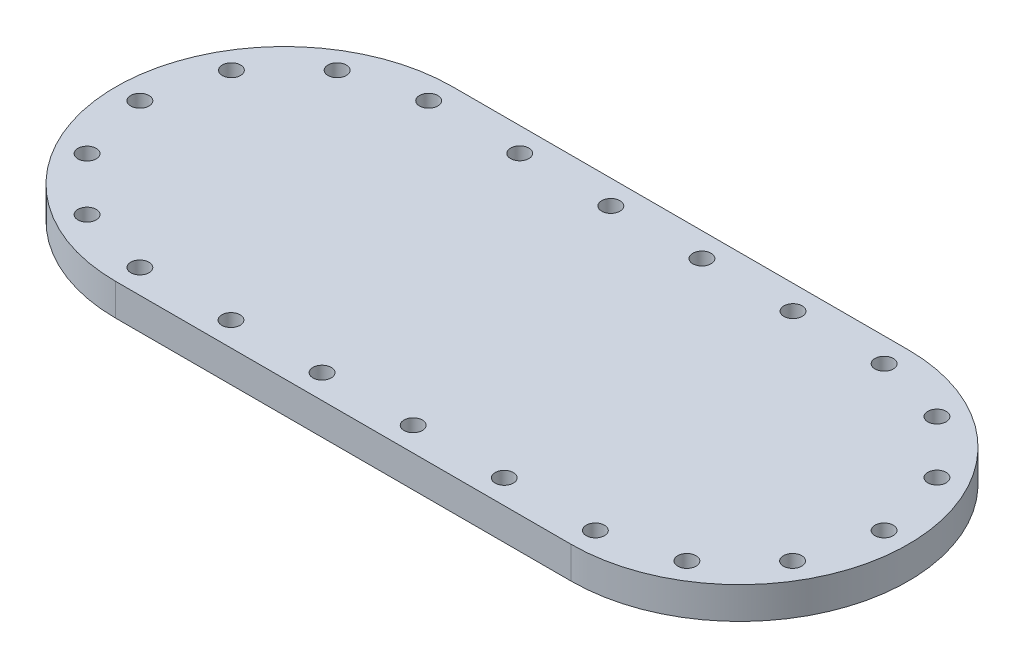
ISO-10303-21;
HEADER;
FILE_DESCRIPTION(('STEP AP214'),'2;1');
FILE_NAME('part.step','',(''),(''),'','','');
FILE_SCHEMA(('AUTOMOTIVE_DESIGN { 1 0 10303 214 1 1 1 1 }'));
ENDSEC;
DATA;
#1=APPLICATION_CONTEXT('core data for automotive mechanical design processes');
#2=APPLICATION_PROTOCOL_DEFINITION('international standard','automotive_design',2000,#1);
#3=PRODUCT_CONTEXT('',#1,'mechanical');
#4=PRODUCT('Part','Part','',(#3));
#5=PRODUCT_RELATED_PRODUCT_CATEGORY('part','',(#4));
#6=PRODUCT_DEFINITION_FORMATION('','',#4);
#7=PRODUCT_DEFINITION_CONTEXT('part definition',#1,'design');
#8=PRODUCT_DEFINITION('design','',#6,#7);
#9=PRODUCT_DEFINITION_SHAPE('','',#8);
#10=(LENGTH_UNIT() NAMED_UNIT(*) SI_UNIT(.MILLI.,.METRE.));
#11=(NAMED_UNIT(*) PLANE_ANGLE_UNIT() SI_UNIT($,.RADIAN.));
#12=(NAMED_UNIT(*) SI_UNIT($,.STERADIAN.) SOLID_ANGLE_UNIT());
#13=UNCERTAINTY_MEASURE_WITH_UNIT(LENGTH_MEASURE(1.E-05),#10,'distance_accuracy_value','');
#14=(GEOMETRIC_REPRESENTATION_CONTEXT(3) GLOBAL_UNCERTAINTY_ASSIGNED_CONTEXT((#13)) GLOBAL_UNIT_ASSIGNED_CONTEXT((#10,
#11,#12)) REPRESENTATION_CONTEXT('',''));
#15=CARTESIAN_POINT('',(0.,0.,0.));
#16=DIRECTION('',(0.,0.,1.));
#17=DIRECTION('',(1.,0.,0.));
#18=AXIS2_PLACEMENT_3D('',#15,#16,#17);
#19=CARTESIAN_POINT('',(0.,8.89,-46.99));
#20=DIRECTION('',(0.,0.,-1.));
#21=DIRECTION('',(-1.,0.,0.));
#22=AXIS2_PLACEMENT_3D('',#19,#20,#21);
#23=PLANE('',#22);
#24=DIRECTION('',(1.,0.,0.));
#25=VECTOR('',#24,1.);
#26=CARTESIAN_POINT('',(0.,0.,-46.99));
#27=LINE('',#26,#25);
#28=CARTESIAN_POINT('',(-63.5,0.,-46.99));
#29=VERTEX_POINT('',#28);
#30=CARTESIAN_POINT('',(63.5,0.,-46.99));
#31=VERTEX_POINT('',#30);
#32=EDGE_CURVE('E100',#29,#31,#27,.T.);
#33=ORIENTED_EDGE('',*,*,#32,.F.);
#34=DIRECTION('',(0.,-1.,0.));
#35=VECTOR('',#34,1.);
#36=CARTESIAN_POINT('',(-63.5,8.89,-46.99));
#37=LINE('',#36,#35);
#38=CARTESIAN_POINT('',(-63.5,8.89,-46.99));
#39=VERTEX_POINT('',#38);
#40=EDGE_CURVE('E11',#39,#29,#37,.T.);
#41=ORIENTED_EDGE('',*,*,#40,.F.);
#42=DIRECTION('',(1.,0.,0.));
#43=VECTOR('',#42,1.);
#44=CARTESIAN_POINT('',(0.,8.89,-46.99));
#45=LINE('',#44,#43);
#46=CARTESIAN_POINT('',(63.5,8.89,-46.99));
#47=VERTEX_POINT('',#46);
#48=EDGE_CURVE('E88',#39,#47,#45,.T.);
#49=ORIENTED_EDGE('',*,*,#48,.T.);
#50=DIRECTION('',(0.,-1.,0.));
#51=VECTOR('',#50,1.);
#52=CARTESIAN_POINT('',(63.5,8.89,-46.99));
#53=LINE('',#52,#51);
#54=EDGE_CURVE('E77',#47,#31,#53,.T.);
#55=ORIENTED_EDGE('',*,*,#54,.T.);
#56=EDGE_LOOP('',(#33,#41,#49,#55));
#57=FACE_BOUND('',#56,.T.);
#58=ADVANCED_FACE('F38',(#57),#23,.T.);
#59=CARTESIAN_POINT('',(-63.5,8.89,0.));
#60=DIRECTION('',(0.,-1.,0.));
#61=DIRECTION('',(0.,0.,-1.));
#62=AXIS2_PLACEMENT_3D('',#59,#60,#61);
#63=CYLINDRICAL_SURFACE('',#62,46.99);
#64=CARTESIAN_POINT('',(-63.5,0.,0.));
#65=DIRECTION('',(0.,1.,0.));
#66=DIRECTION('',(0.,0.,1.));
#67=AXIS2_PLACEMENT_3D('',#64,#65,#66);
#68=CIRCLE('',#67,46.99);
#69=CARTESIAN_POINT('',(-63.5,0.,46.99));
#70=VERTEX_POINT('',#69);
#71=EDGE_CURVE('E93',#29,#70,#68,.T.);
#72=ORIENTED_EDGE('',*,*,#71,.T.);
#73=DIRECTION('',(0.,-1.,0.));
#74=VECTOR('',#73,1.);
#75=CARTESIAN_POINT('',(-63.5,8.89,46.99));
#76=LINE('',#75,#74);
#77=CARTESIAN_POINT('',(-63.5,8.89,46.99));
#78=VERTEX_POINT('',#77);
#79=EDGE_CURVE('E46',#78,#70,#76,.T.);
#80=ORIENTED_EDGE('',*,*,#79,.F.);
#81=CARTESIAN_POINT('',(-63.5,8.89,0.));
#82=DIRECTION('',(0.,1.,0.));
#83=DIRECTION('',(0.,0.,1.));
#84=AXIS2_PLACEMENT_3D('',#81,#82,#83);
#85=CIRCLE('',#84,46.99);
#86=EDGE_CURVE('E83',#39,#78,#85,.T.);
#87=ORIENTED_EDGE('',*,*,#86,.F.);
#88=ORIENTED_EDGE('',*,*,#40,.T.);
#89=EDGE_LOOP('',(#72,#80,#87,#88));
#90=FACE_BOUND('',#89,.T.);
#91=ADVANCED_FACE('F91',(#90),#63,.T.);
#92=CARTESIAN_POINT('',(0.,8.89,46.99));
#93=DIRECTION('',(0.,0.,-1.));
#94=DIRECTION('',(-1.,0.,0.));
#95=AXIS2_PLACEMENT_3D('',#92,#93,#94);
#96=PLANE('',#95);
#97=DIRECTION('',(1.,0.,0.));
#98=VECTOR('',#97,1.);
#99=CARTESIAN_POINT('',(0.,0.,46.99));
#100=LINE('',#99,#98);
#101=CARTESIAN_POINT('',(63.5,0.,46.99));
#102=VERTEX_POINT('',#101);
#103=EDGE_CURVE('E70',#70,#102,#100,.T.);
#104=ORIENTED_EDGE('',*,*,#103,.T.);
#105=DIRECTION('',(0.,-1.,0.));
#106=VECTOR('',#105,1.);
#107=CARTESIAN_POINT('',(63.5,8.89,46.99));
#108=LINE('',#107,#106);
#109=CARTESIAN_POINT('',(63.5,8.89,46.99));
#110=VERTEX_POINT('',#109);
#111=EDGE_CURVE('E94',#110,#102,#108,.T.);
#112=ORIENTED_EDGE('',*,*,#111,.F.);
#113=DIRECTION('',(1.,0.,0.));
#114=VECTOR('',#113,1.);
#115=CARTESIAN_POINT('',(0.,8.89,46.99));
#116=LINE('',#115,#114);
#117=EDGE_CURVE('E87',#78,#110,#116,.T.);
#118=ORIENTED_EDGE('',*,*,#117,.F.);
#119=ORIENTED_EDGE('',*,*,#79,.T.);
#120=EDGE_LOOP('',(#104,#112,#118,#119));
#121=FACE_BOUND('',#120,.T.);
#122=ADVANCED_FACE('F95',(#121),#96,.F.);
#123=CARTESIAN_POINT('',(63.5,8.89,0.));
#124=DIRECTION('',(0.,-1.,0.));
#125=DIRECTION('',(0.,0.,-1.));
#126=AXIS2_PLACEMENT_3D('',#123,#124,#125);
#127=CYLINDRICAL_SURFACE('',#126,46.99);
#128=CARTESIAN_POINT('',(63.5,0.,0.));
#129=DIRECTION('',(0.,1.,0.));
#130=DIRECTION('',(0.,0.,1.));
#131=AXIS2_PLACEMENT_3D('',#128,#129,#130);
#132=CIRCLE('',#131,46.99);
#133=EDGE_CURVE('E106',#102,#31,#132,.T.);
#134=ORIENTED_EDGE('',*,*,#133,.T.);
#135=ORIENTED_EDGE('',*,*,#54,.F.);
#136=CARTESIAN_POINT('',(63.5,8.89,0.));
#137=DIRECTION('',(0.,1.,0.));
#138=DIRECTION('',(0.,0.,1.));
#139=AXIS2_PLACEMENT_3D('',#136,#137,#138);
#140=CIRCLE('',#139,46.99);
#141=EDGE_CURVE('E54',#110,#47,#140,.T.);
#142=ORIENTED_EDGE('',*,*,#141,.F.);
#143=ORIENTED_EDGE('',*,*,#111,.T.);
#144=EDGE_LOOP('',(#134,#135,#142,#143));
#145=FACE_BOUND('',#144,.T.);
#146=ADVANCED_FACE('F111',(#145),#127,.T.);
#147=CARTESIAN_POINT('',(0.,8.89,0.));
#148=DIRECTION('',(0.,1.,0.));
#149=DIRECTION('',(0.,0.,1.));
#150=AXIS2_PLACEMENT_3D('',#147,#148,#149);
#151=PLANE('',#150);
#152=CARTESIAN_POINT('',(63.5000000000001,8.89,-40.259));
#153=DIRECTION('',(0.,-1.,0.));
#154=DIRECTION('',(0.,0.,-1.));
#155=AXIS2_PLACEMENT_3D('',#152,#153,#154);
#156=CIRCLE('',#155,2.55270000000001);
#157=CARTESIAN_POINT('',(63.5000000000001,8.89,-42.8117));
#158=VERTEX_POINT('',#157);
#159=EDGE_CURVE('E256',#158,#158,#156,.T.);
#160=ORIENTED_EDGE('',*,*,#159,.T.);
#161=EDGE_LOOP('',(#160));
#162=FACE_BOUND('',#161,.T.);
#163=CARTESIAN_POINT('',(38.1000000000005,8.89,-40.2589999999993));
#164=DIRECTION('',(0.,-1.,0.));
#165=DIRECTION('',(0.,0.,-1.));
#166=AXIS2_PLACEMENT_3D('',#163,#164,#165);
#167=CIRCLE('',#166,2.55270000000005);
#168=CARTESIAN_POINT('',(38.1000000000005,8.89,-42.8116999999993));
#169=VERTEX_POINT('',#168);
#170=EDGE_CURVE('E263',#169,#169,#167,.T.);
#171=ORIENTED_EDGE('',*,*,#170,.T.);
#172=EDGE_LOOP('',(#171));
#173=FACE_BOUND('',#172,.T.);
#174=CARTESIAN_POINT('',(12.7000000000005,8.89,-40.2589999999995));
#175=DIRECTION('',(0.,-1.,0.));
#176=DIRECTION('',(0.,0.,-1.));
#177=AXIS2_PLACEMENT_3D('',#174,#175,#176);
#178=CIRCLE('',#177,2.5527);
#179=CARTESIAN_POINT('',(12.7000000000005,8.89,-42.8116999999995));
#180=VERTEX_POINT('',#179);
#181=EDGE_CURVE('E269',#180,#180,#178,.T.);
#182=ORIENTED_EDGE('',*,*,#181,.T.);
#183=EDGE_LOOP('',(#182));
#184=FACE_BOUND('',#183,.T.);
#185=CARTESIAN_POINT('',(-12.6999999999995,8.89,-40.2589999999996));
#186=DIRECTION('',(0.,-1.,0.));
#187=DIRECTION('',(0.,0.,-1.));
#188=AXIS2_PLACEMENT_3D('',#185,#186,#187);
#189=CIRCLE('',#188,2.5527);
#190=CARTESIAN_POINT('',(-12.6999999999995,8.89,-42.8116999999996));
#191=VERTEX_POINT('',#190);
#192=EDGE_CURVE('E275',#191,#191,#189,.T.);
#193=ORIENTED_EDGE('',*,*,#192,.T.);
#194=EDGE_LOOP('',(#193));
#195=FACE_BOUND('',#194,.T.);
#196=CARTESIAN_POINT('',(-38.0999999999995,8.89,-40.2589999999998));
#197=DIRECTION('',(0.,-1.,0.));
#198=DIRECTION('',(0.,0.,-1.));
#199=AXIS2_PLACEMENT_3D('',#196,#197,#198);
#200=CIRCLE('',#199,2.55270000000002);
#201=CARTESIAN_POINT('',(-38.0999999999995,8.89,-42.8116999999998));
#202=VERTEX_POINT('',#201);
#203=EDGE_CURVE('E281',#202,#202,#200,.T.);
#204=ORIENTED_EDGE('',*,*,#203,.T.);
#205=EDGE_LOOP('',(#204));
#206=FACE_BOUND('',#205,.T.);
#207=CARTESIAN_POINT('',(-63.4999999999999,8.89,-40.259));
#208=DIRECTION('',(0.,-1.,0.));
#209=DIRECTION('',(0.,0.,-1.));
#210=AXIS2_PLACEMENT_3D('',#207,#208,#209);
#211=CIRCLE('',#210,2.5527);
#212=CARTESIAN_POINT('',(-63.4999999999999,8.89,-42.8117));
#213=VERTEX_POINT('',#212);
#214=EDGE_CURVE('E287',#213,#213,#211,.T.);
#215=ORIENTED_EDGE('',*,*,#214,.T.);
#216=EDGE_LOOP('',(#215));
#217=FACE_BOUND('',#216,.T.);
#218=CARTESIAN_POINT('',(-83.6294999999993,8.89,-34.865316730959));
#219=DIRECTION('',(0.,-1.,0.));
#220=DIRECTION('',(0.,0.,-1.));
#221=AXIS2_PLACEMENT_3D('',#218,#219,#220);
#222=CIRCLE('',#221,2.55270000000001);
#223=CARTESIAN_POINT('',(-83.6294999999993,8.89,-37.418016730959));
#224=VERTEX_POINT('',#223);
#225=EDGE_CURVE('E293',#224,#224,#222,.T.);
#226=ORIENTED_EDGE('',*,*,#225,.T.);
#227=EDGE_LOOP('',(#226));
#228=FACE_BOUND('',#227,.T.);
#229=CARTESIAN_POINT('',(-98.3653167309572,8.89,-20.1295000000018));
#230=DIRECTION('',(0.,-1.,0.));
#231=DIRECTION('',(0.,0.,-1.));
#232=AXIS2_PLACEMENT_3D('',#229,#230,#231);
#233=CIRCLE('',#232,2.55270000000001);
#234=CARTESIAN_POINT('',(-98.3653167309572,8.89,-22.6822000000018));
#235=VERTEX_POINT('',#234);
#236=EDGE_CURVE('E299',#235,#235,#233,.T.);
#237=ORIENTED_EDGE('',*,*,#236,.T.);
#238=EDGE_LOOP('',(#237));
#239=FACE_BOUND('',#238,.T.);
#240=CARTESIAN_POINT('',(-103.759,8.89,7.24545224474049E-13));
#241=DIRECTION('',(0.,-1.,0.));
#242=DIRECTION('',(0.,0.,-1.));
#243=AXIS2_PLACEMENT_3D('',#240,#241,#242);
#244=CIRCLE('',#243,2.55270000000001);
#245=CARTESIAN_POINT('',(-103.759,8.89,-2.55269999999929));
#246=VERTEX_POINT('',#245);
#247=EDGE_CURVE('E305',#246,#246,#244,.T.);
#248=ORIENTED_EDGE('',*,*,#247,.T.);
#249=EDGE_LOOP('',(#248));
#250=FACE_BOUND('',#249,.T.);
#251=CARTESIAN_POINT('',(-98.3653167309575,8.89,20.1295000000004));
#252=DIRECTION('',(0.,-1.,0.));
#253=DIRECTION('',(0.,0.,-1.));
#254=AXIS2_PLACEMENT_3D('',#251,#252,#253);
#255=CIRCLE('',#254,2.55270000000001);
#256=CARTESIAN_POINT('',(-98.3653167309575,8.89,17.5768000000004));
#257=VERTEX_POINT('',#256);
#258=EDGE_CURVE('E311',#257,#257,#255,.T.);
#259=ORIENTED_EDGE('',*,*,#258,.T.);
#260=EDGE_LOOP('',(#259));
#261=FACE_BOUND('',#260,.T.);
#262=CARTESIAN_POINT('',(-83.6294999999998,8.89,34.8653167309579));
#263=DIRECTION('',(0.,-1.,0.));
#264=DIRECTION('',(0.,0.,-1.));
#265=AXIS2_PLACEMENT_3D('',#262,#263,#264);
#266=CIRCLE('',#265,2.55270000000003);
#267=CARTESIAN_POINT('',(-83.6294999999998,8.89,32.3126167309578));
#268=VERTEX_POINT('',#267);
#269=EDGE_CURVE('E317',#268,#268,#266,.T.);
#270=ORIENTED_EDGE('',*,*,#269,.T.);
#271=EDGE_LOOP('',(#270));
#272=FACE_BOUND('',#271,.T.);
#273=CARTESIAN_POINT('',(-63.5000000000005,8.89,40.2589999999991));
#274=DIRECTION('',(0.,-1.,0.));
#275=DIRECTION('',(0.,0.,-1.));
#276=AXIS2_PLACEMENT_3D('',#273,#274,#275);
#277=CIRCLE('',#276,2.55270000000001);
#278=CARTESIAN_POINT('',(-63.5000000000005,8.89,37.7062999999991));
#279=VERTEX_POINT('',#278);
#280=EDGE_CURVE('E323',#279,#279,#277,.T.);
#281=ORIENTED_EDGE('',*,*,#280,.T.);
#282=EDGE_LOOP('',(#281));
#283=FACE_BOUND('',#282,.T.);
#284=CARTESIAN_POINT('',(-38.1000000000001,8.89,40.2589999999993));
#285=DIRECTION('',(0.,-1.,0.));
#286=DIRECTION('',(0.,0.,-1.));
#287=AXIS2_PLACEMENT_3D('',#284,#285,#286);
#288=CIRCLE('',#287,2.55270000000001);
#289=CARTESIAN_POINT('',(-38.1000000000001,8.89,37.7062999999993));
#290=VERTEX_POINT('',#289);
#291=EDGE_CURVE('E329',#290,#290,#288,.T.);
#292=ORIENTED_EDGE('',*,*,#291,.T.);
#293=EDGE_LOOP('',(#292));
#294=FACE_BOUND('',#293,.T.);
#295=CARTESIAN_POINT('',(-12.7000000000001,8.89,40.2589999999995));
#296=DIRECTION('',(0.,-1.,0.));
#297=DIRECTION('',(0.,0.,-1.));
#298=AXIS2_PLACEMENT_3D('',#295,#296,#297);
#299=CIRCLE('',#298,2.55270000000001);
#300=CARTESIAN_POINT('',(-12.7000000000001,8.89,37.7062999999994));
#301=VERTEX_POINT('',#300);
#302=EDGE_CURVE('E335',#301,#301,#299,.T.);
#303=ORIENTED_EDGE('',*,*,#302,.T.);
#304=EDGE_LOOP('',(#303));
#305=FACE_BOUND('',#304,.T.);
#306=CARTESIAN_POINT('',(12.6999999999999,8.89,40.2589999999996));
#307=DIRECTION('',(0.,-1.,0.));
#308=DIRECTION('',(0.,0.,-1.));
#309=AXIS2_PLACEMENT_3D('',#306,#307,#308);
#310=CIRCLE('',#309,2.55270000000001);
#311=CARTESIAN_POINT('',(12.6999999999999,8.89,37.7062999999996));
#312=VERTEX_POINT('',#311);
#313=EDGE_CURVE('E341',#312,#312,#310,.T.);
#314=ORIENTED_EDGE('',*,*,#313,.T.);
#315=EDGE_LOOP('',(#314));
#316=FACE_BOUND('',#315,.T.);
#317=CARTESIAN_POINT('',(38.0999999999999,8.89,40.2589999999998));
#318=DIRECTION('',(0.,-1.,0.));
#319=DIRECTION('',(0.,0.,-1.));
#320=AXIS2_PLACEMENT_3D('',#317,#318,#319);
#321=CIRCLE('',#320,2.55270000000001);
#322=CARTESIAN_POINT('',(38.0999999999999,8.89,37.7062999999998));
#323=VERTEX_POINT('',#322);
#324=EDGE_CURVE('E347',#323,#323,#321,.T.);
#325=ORIENTED_EDGE('',*,*,#324,.T.);
#326=EDGE_LOOP('',(#325));
#327=FACE_BOUND('',#326,.T.);
#328=CARTESIAN_POINT('',(63.4999999999999,8.89,40.259));
#329=DIRECTION('',(0.,-1.,0.));
#330=DIRECTION('',(0.,0.,-1.));
#331=AXIS2_PLACEMENT_3D('',#328,#329,#330);
#332=CIRCLE('',#331,2.55270000000001);
#333=CARTESIAN_POINT('',(63.4999999999999,8.89,37.7063));
#334=VERTEX_POINT('',#333);
#335=EDGE_CURVE('E223',#334,#334,#332,.T.);
#336=ORIENTED_EDGE('',*,*,#335,.T.);
#337=EDGE_LOOP('',(#336));
#338=FACE_BOUND('',#337,.T.);
#339=CARTESIAN_POINT('',(83.6294999999998,8.89,34.8653167309579));
#340=DIRECTION('',(0.,-1.,0.));
#341=DIRECTION('',(0.,0.,-1.));
#342=AXIS2_PLACEMENT_3D('',#339,#340,#341);
#343=CIRCLE('',#342,2.55270000000003);
#344=CARTESIAN_POINT('',(83.6294999999998,8.89,32.3126167309578));
#345=VERTEX_POINT('',#344);
#346=EDGE_CURVE('E228',#345,#345,#343,.T.);
#347=ORIENTED_EDGE('',*,*,#346,.T.);
#348=EDGE_LOOP('',(#347));
#349=FACE_BOUND('',#348,.T.);
#350=CARTESIAN_POINT('',(98.3653167309575,8.89,20.1295000000004));
#351=DIRECTION('',(0.,-1.,0.));
#352=DIRECTION('',(0.,0.,-1.));
#353=AXIS2_PLACEMENT_3D('',#350,#351,#352);
#354=CIRCLE('',#353,2.55270000000001);
#355=CARTESIAN_POINT('',(98.3653167309575,8.89,17.5768000000004));
#356=VERTEX_POINT('',#355);
#357=EDGE_CURVE('E238',#356,#356,#354,.T.);
#358=ORIENTED_EDGE('',*,*,#357,.T.);
#359=EDGE_LOOP('',(#358));
#360=FACE_BOUND('',#359,.T.);
#361=CARTESIAN_POINT('',(103.759,8.89,7.24545224474049E-13));
#362=DIRECTION('',(0.,-1.,0.));
#363=DIRECTION('',(0.,0.,-1.));
#364=AXIS2_PLACEMENT_3D('',#361,#362,#363);
#365=CIRCLE('',#364,2.55270000000001);
#366=CARTESIAN_POINT('',(103.759,8.89,-2.55269999999929));
#367=VERTEX_POINT('',#366);
#368=EDGE_CURVE('E244',#367,#367,#365,.T.);
#369=ORIENTED_EDGE('',*,*,#368,.T.);
#370=EDGE_LOOP('',(#369));
#371=FACE_BOUND('',#370,.T.);
#372=CARTESIAN_POINT('',(98.3653167309578,8.89,-20.129499999999));
#373=DIRECTION('',(0.,-1.,0.));
#374=DIRECTION('',(0.,0.,-1.));
#375=AXIS2_PLACEMENT_3D('',#372,#373,#374);
#376=CIRCLE('',#375,2.55270000000001);
#377=CARTESIAN_POINT('',(98.3653167309578,8.89,-22.682199999999));
#378=VERTEX_POINT('',#377);
#379=EDGE_CURVE('E250',#378,#378,#376,.T.);
#380=ORIENTED_EDGE('',*,*,#379,.T.);
#381=EDGE_LOOP('',(#380));
#382=FACE_BOUND('',#381,.T.);
#383=CARTESIAN_POINT('',(83.6295000000002,8.89,-34.8653167309567));
#384=DIRECTION('',(0.,-1.,0.));
#385=DIRECTION('',(0.,0.,-1.));
#386=AXIS2_PLACEMENT_3D('',#383,#384,#385);
#387=CIRCLE('',#386,2.55270000000001);
#388=CARTESIAN_POINT('',(83.6295000000002,8.89,-37.4180167309567));
#389=VERTEX_POINT('',#388);
#390=EDGE_CURVE('E103',#389,#389,#387,.T.);
#391=ORIENTED_EDGE('',*,*,#390,.T.);
#392=EDGE_LOOP('',(#391));
#393=FACE_BOUND('',#392,.T.);
#394=ORIENTED_EDGE('',*,*,#48,.F.);
#395=ORIENTED_EDGE('',*,*,#86,.T.);
#396=ORIENTED_EDGE('',*,*,#117,.T.);
#397=ORIENTED_EDGE('',*,*,#141,.T.);
#398=EDGE_LOOP('',(#394,#395,#396,#397));
#399=FACE_BOUND('',#398,.T.);
#400=ADVANCED_FACE('F85',(#162,#173,#184,#195,#206,#217,#228,#239,#250,#261,#272,#283,#294,#305,
#316,#327,#338,#349,#360,#371,#382,#393,#399),#151,.T.);
#401=CARTESIAN_POINT('',(0.,0.,0.));
#402=DIRECTION('',(0.,1.,0.));
#403=DIRECTION('',(0.,0.,1.));
#404=AXIS2_PLACEMENT_3D('',#401,#402,#403);
#405=PLANE('',#404);
#406=CARTESIAN_POINT('',(63.5000000000001,0.,-40.259));
#407=DIRECTION('',(0.,-1.,0.));
#408=DIRECTION('',(0.,0.,-1.));
#409=AXIS2_PLACEMENT_3D('',#406,#407,#408);
#410=CIRCLE('',#409,2.55270000000001);
#411=CARTESIAN_POINT('',(63.5000000000001,0.,-42.8117));
#412=VERTEX_POINT('',#411);
#413=EDGE_CURVE('E260',#412,#412,#410,.T.);
#414=ORIENTED_EDGE('',*,*,#413,.F.);
#415=EDGE_LOOP('',(#414));
#416=FACE_BOUND('',#415,.T.);
#417=CARTESIAN_POINT('',(38.1000000000005,0.,-40.2589999999993));
#418=DIRECTION('',(0.,-1.,0.));
#419=DIRECTION('',(0.,0.,-1.));
#420=AXIS2_PLACEMENT_3D('',#417,#418,#419);
#421=CIRCLE('',#420,2.55270000000005);
#422=CARTESIAN_POINT('',(38.1000000000005,0.,-42.8116999999993));
#423=VERTEX_POINT('',#422);
#424=EDGE_CURVE('E266',#423,#423,#421,.T.);
#425=ORIENTED_EDGE('',*,*,#424,.F.);
#426=EDGE_LOOP('',(#425));
#427=FACE_BOUND('',#426,.T.);
#428=CARTESIAN_POINT('',(12.7000000000005,0.,-40.2589999999995));
#429=DIRECTION('',(0.,-1.,0.));
#430=DIRECTION('',(0.,0.,-1.));
#431=AXIS2_PLACEMENT_3D('',#428,#429,#430);
#432=CIRCLE('',#431,2.5527);
#433=CARTESIAN_POINT('',(12.7000000000005,0.,-42.8116999999995));
#434=VERTEX_POINT('',#433);
#435=EDGE_CURVE('E272',#434,#434,#432,.T.);
#436=ORIENTED_EDGE('',*,*,#435,.F.);
#437=EDGE_LOOP('',(#436));
#438=FACE_BOUND('',#437,.T.);
#439=CARTESIAN_POINT('',(-12.6999999999995,0.,-40.2589999999996));
#440=DIRECTION('',(0.,-1.,0.));
#441=DIRECTION('',(0.,0.,-1.));
#442=AXIS2_PLACEMENT_3D('',#439,#440,#441);
#443=CIRCLE('',#442,2.5527);
#444=CARTESIAN_POINT('',(-12.6999999999995,0.,-42.8116999999996));
#445=VERTEX_POINT('',#444);
#446=EDGE_CURVE('E278',#445,#445,#443,.T.);
#447=ORIENTED_EDGE('',*,*,#446,.F.);
#448=EDGE_LOOP('',(#447));
#449=FACE_BOUND('',#448,.T.);
#450=CARTESIAN_POINT('',(-38.0999999999995,0.,-40.2589999999998));
#451=DIRECTION('',(0.,-1.,0.));
#452=DIRECTION('',(0.,0.,-1.));
#453=AXIS2_PLACEMENT_3D('',#450,#451,#452);
#454=CIRCLE('',#453,2.55270000000002);
#455=CARTESIAN_POINT('',(-38.0999999999995,0.,-42.8116999999998));
#456=VERTEX_POINT('',#455);
#457=EDGE_CURVE('E284',#456,#456,#454,.T.);
#458=ORIENTED_EDGE('',*,*,#457,.F.);
#459=EDGE_LOOP('',(#458));
#460=FACE_BOUND('',#459,.T.);
#461=CARTESIAN_POINT('',(-63.4999999999999,0.,-40.259));
#462=DIRECTION('',(0.,-1.,0.));
#463=DIRECTION('',(0.,0.,-1.));
#464=AXIS2_PLACEMENT_3D('',#461,#462,#463);
#465=CIRCLE('',#464,2.5527);
#466=CARTESIAN_POINT('',(-63.4999999999999,0.,-42.8117));
#467=VERTEX_POINT('',#466);
#468=EDGE_CURVE('E290',#467,#467,#465,.T.);
#469=ORIENTED_EDGE('',*,*,#468,.F.);
#470=EDGE_LOOP('',(#469));
#471=FACE_BOUND('',#470,.T.);
#472=CARTESIAN_POINT('',(-83.6294999999993,0.,-34.865316730959));
#473=DIRECTION('',(0.,-1.,0.));
#474=DIRECTION('',(0.,0.,-1.));
#475=AXIS2_PLACEMENT_3D('',#472,#473,#474);
#476=CIRCLE('',#475,2.55270000000001);
#477=CARTESIAN_POINT('',(-83.6294999999993,0.,-37.418016730959));
#478=VERTEX_POINT('',#477);
#479=EDGE_CURVE('E296',#478,#478,#476,.T.);
#480=ORIENTED_EDGE('',*,*,#479,.F.);
#481=EDGE_LOOP('',(#480));
#482=FACE_BOUND('',#481,.T.);
#483=CARTESIAN_POINT('',(-98.3653167309572,0.,-20.1295000000018));
#484=DIRECTION('',(0.,-1.,0.));
#485=DIRECTION('',(0.,0.,-1.));
#486=AXIS2_PLACEMENT_3D('',#483,#484,#485);
#487=CIRCLE('',#486,2.55270000000001);
#488=CARTESIAN_POINT('',(-98.3653167309572,0.,-22.6822000000018));
#489=VERTEX_POINT('',#488);
#490=EDGE_CURVE('E302',#489,#489,#487,.T.);
#491=ORIENTED_EDGE('',*,*,#490,.F.);
#492=EDGE_LOOP('',(#491));
#493=FACE_BOUND('',#492,.T.);
#494=CARTESIAN_POINT('',(-103.759,0.,7.24545224474049E-13));
#495=DIRECTION('',(0.,-1.,0.));
#496=DIRECTION('',(0.,0.,-1.));
#497=AXIS2_PLACEMENT_3D('',#494,#495,#496);
#498=CIRCLE('',#497,2.55270000000001);
#499=CARTESIAN_POINT('',(-103.759,0.,-2.55269999999929));
#500=VERTEX_POINT('',#499);
#501=EDGE_CURVE('E308',#500,#500,#498,.T.);
#502=ORIENTED_EDGE('',*,*,#501,.F.);
#503=EDGE_LOOP('',(#502));
#504=FACE_BOUND('',#503,.T.);
#505=CARTESIAN_POINT('',(-98.3653167309575,0.,20.1295000000004));
#506=DIRECTION('',(0.,-1.,0.));
#507=DIRECTION('',(0.,0.,-1.));
#508=AXIS2_PLACEMENT_3D('',#505,#506,#507);
#509=CIRCLE('',#508,2.55270000000001);
#510=CARTESIAN_POINT('',(-98.3653167309575,0.,17.5768000000004));
#511=VERTEX_POINT('',#510);
#512=EDGE_CURVE('E314',#511,#511,#509,.T.);
#513=ORIENTED_EDGE('',*,*,#512,.F.);
#514=EDGE_LOOP('',(#513));
#515=FACE_BOUND('',#514,.T.);
#516=CARTESIAN_POINT('',(-83.6294999999998,0.,34.8653167309579));
#517=DIRECTION('',(0.,-1.,0.));
#518=DIRECTION('',(0.,0.,-1.));
#519=AXIS2_PLACEMENT_3D('',#516,#517,#518);
#520=CIRCLE('',#519,2.55270000000003);
#521=CARTESIAN_POINT('',(-83.6294999999998,0.,32.3126167309578));
#522=VERTEX_POINT('',#521);
#523=EDGE_CURVE('E320',#522,#522,#520,.T.);
#524=ORIENTED_EDGE('',*,*,#523,.F.);
#525=EDGE_LOOP('',(#524));
#526=FACE_BOUND('',#525,.T.);
#527=CARTESIAN_POINT('',(-63.5000000000005,0.,40.2589999999991));
#528=DIRECTION('',(0.,-1.,0.));
#529=DIRECTION('',(0.,0.,-1.));
#530=AXIS2_PLACEMENT_3D('',#527,#528,#529);
#531=CIRCLE('',#530,2.55270000000001);
#532=CARTESIAN_POINT('',(-63.5000000000005,0.,37.7062999999991));
#533=VERTEX_POINT('',#532);
#534=EDGE_CURVE('E326',#533,#533,#531,.T.);
#535=ORIENTED_EDGE('',*,*,#534,.F.);
#536=EDGE_LOOP('',(#535));
#537=FACE_BOUND('',#536,.T.);
#538=CARTESIAN_POINT('',(-38.1000000000001,0.,40.2589999999993));
#539=DIRECTION('',(0.,-1.,0.));
#540=DIRECTION('',(0.,0.,-1.));
#541=AXIS2_PLACEMENT_3D('',#538,#539,#540);
#542=CIRCLE('',#541,2.55270000000001);
#543=CARTESIAN_POINT('',(-38.1000000000001,0.,37.7062999999993));
#544=VERTEX_POINT('',#543);
#545=EDGE_CURVE('E332',#544,#544,#542,.T.);
#546=ORIENTED_EDGE('',*,*,#545,.F.);
#547=EDGE_LOOP('',(#546));
#548=FACE_BOUND('',#547,.T.);
#549=CARTESIAN_POINT('',(-12.7000000000001,0.,40.2589999999995));
#550=DIRECTION('',(0.,-1.,0.));
#551=DIRECTION('',(0.,0.,-1.));
#552=AXIS2_PLACEMENT_3D('',#549,#550,#551);
#553=CIRCLE('',#552,2.55270000000001);
#554=CARTESIAN_POINT('',(-12.7000000000001,0.,37.7062999999994));
#555=VERTEX_POINT('',#554);
#556=EDGE_CURVE('E338',#555,#555,#553,.T.);
#557=ORIENTED_EDGE('',*,*,#556,.F.);
#558=EDGE_LOOP('',(#557));
#559=FACE_BOUND('',#558,.T.);
#560=CARTESIAN_POINT('',(12.6999999999999,0.,40.2589999999996));
#561=DIRECTION('',(0.,-1.,0.));
#562=DIRECTION('',(0.,0.,-1.));
#563=AXIS2_PLACEMENT_3D('',#560,#561,#562);
#564=CIRCLE('',#563,2.55270000000001);
#565=CARTESIAN_POINT('',(12.6999999999999,0.,37.7062999999996));
#566=VERTEX_POINT('',#565);
#567=EDGE_CURVE('E344',#566,#566,#564,.T.);
#568=ORIENTED_EDGE('',*,*,#567,.F.);
#569=EDGE_LOOP('',(#568));
#570=FACE_BOUND('',#569,.T.);
#571=CARTESIAN_POINT('',(38.0999999999999,0.,40.2589999999998));
#572=DIRECTION('',(0.,-1.,0.));
#573=DIRECTION('',(0.,0.,-1.));
#574=AXIS2_PLACEMENT_3D('',#571,#572,#573);
#575=CIRCLE('',#574,2.55270000000001);
#576=CARTESIAN_POINT('',(38.0999999999999,0.,37.7062999999998));
#577=VERTEX_POINT('',#576);
#578=EDGE_CURVE('E230',#577,#577,#575,.T.);
#579=ORIENTED_EDGE('',*,*,#578,.F.);
#580=EDGE_LOOP('',(#579));
#581=FACE_BOUND('',#580,.T.);
#582=CARTESIAN_POINT('',(63.4999999999999,0.,40.259));
#583=DIRECTION('',(0.,-1.,0.));
#584=DIRECTION('',(0.,0.,-1.));
#585=AXIS2_PLACEMENT_3D('',#582,#583,#584);
#586=CIRCLE('',#585,2.55270000000001);
#587=CARTESIAN_POINT('',(63.4999999999999,0.,37.7063));
#588=VERTEX_POINT('',#587);
#589=EDGE_CURVE('E226',#588,#588,#586,.T.);
#590=ORIENTED_EDGE('',*,*,#589,.F.);
#591=EDGE_LOOP('',(#590));
#592=FACE_BOUND('',#591,.T.);
#593=CARTESIAN_POINT('',(83.6294999999998,0.,34.8653167309579));
#594=DIRECTION('',(0.,-1.,0.));
#595=DIRECTION('',(0.,0.,-1.));
#596=AXIS2_PLACEMENT_3D('',#593,#594,#595);
#597=CIRCLE('',#596,2.55270000000003);
#598=CARTESIAN_POINT('',(83.6294999999998,0.,32.3126167309578));
#599=VERTEX_POINT('',#598);
#600=EDGE_CURVE('E233',#599,#599,#597,.T.);
#601=ORIENTED_EDGE('',*,*,#600,.F.);
#602=EDGE_LOOP('',(#601));
#603=FACE_BOUND('',#602,.T.);
#604=CARTESIAN_POINT('',(98.3653167309575,0.,20.1295000000004));
#605=DIRECTION('',(0.,-1.,0.));
#606=DIRECTION('',(0.,0.,-1.));
#607=AXIS2_PLACEMENT_3D('',#604,#605,#606);
#608=CIRCLE('',#607,2.55270000000001);
#609=CARTESIAN_POINT('',(98.3653167309575,0.,17.5768000000004));
#610=VERTEX_POINT('',#609);
#611=EDGE_CURVE('E241',#610,#610,#608,.T.);
#612=ORIENTED_EDGE('',*,*,#611,.F.);
#613=EDGE_LOOP('',(#612));
#614=FACE_BOUND('',#613,.T.);
#615=CARTESIAN_POINT('',(103.759,0.,7.24545224474049E-13));
#616=DIRECTION('',(0.,-1.,0.));
#617=DIRECTION('',(0.,0.,-1.));
#618=AXIS2_PLACEMENT_3D('',#615,#616,#617);
#619=CIRCLE('',#618,2.55270000000001);
#620=CARTESIAN_POINT('',(103.759,0.,-2.55269999999929));
#621=VERTEX_POINT('',#620);
#622=EDGE_CURVE('E247',#621,#621,#619,.T.);
#623=ORIENTED_EDGE('',*,*,#622,.F.);
#624=EDGE_LOOP('',(#623));
#625=FACE_BOUND('',#624,.T.);
#626=CARTESIAN_POINT('',(98.3653167309578,0.,-20.129499999999));
#627=DIRECTION('',(0.,-1.,0.));
#628=DIRECTION('',(0.,0.,-1.));
#629=AXIS2_PLACEMENT_3D('',#626,#627,#628);
#630=CIRCLE('',#629,2.55270000000001);
#631=CARTESIAN_POINT('',(98.3653167309578,0.,-22.682199999999));
#632=VERTEX_POINT('',#631);
#633=EDGE_CURVE('E253',#632,#632,#630,.T.);
#634=ORIENTED_EDGE('',*,*,#633,.F.);
#635=EDGE_LOOP('',(#634));
#636=FACE_BOUND('',#635,.T.);
#637=CARTESIAN_POINT('',(83.6295000000002,0.,-34.8653167309567));
#638=DIRECTION('',(0.,-1.,0.));
#639=DIRECTION('',(0.,0.,-1.));
#640=AXIS2_PLACEMENT_3D('',#637,#638,#639);
#641=CIRCLE('',#640,2.55270000000001);
#642=CARTESIAN_POINT('',(83.6295000000002,0.,-37.4180167309567));
#643=VERTEX_POINT('',#642);
#644=EDGE_CURVE('E259',#643,#643,#641,.T.);
#645=ORIENTED_EDGE('',*,*,#644,.F.);
#646=EDGE_LOOP('',(#645));
#647=FACE_BOUND('',#646,.T.);
#648=ORIENTED_EDGE('',*,*,#32,.T.);
#649=ORIENTED_EDGE('',*,*,#133,.F.);
#650=ORIENTED_EDGE('',*,*,#103,.F.);
#651=ORIENTED_EDGE('',*,*,#71,.F.);
#652=EDGE_LOOP('',(#648,#649,#650,#651));
#653=FACE_BOUND('',#652,.T.);
#654=ADVANCED_FACE('F113',(#416,#427,#438,#449,#460,#471,#482,#493,#504,#515,#526,#537,#548,
#559,#570,#581,#592,#603,#614,#625,#636,#647,#653),#405,.F.);
#655=CARTESIAN_POINT('',(83.6295000000002,8.89,-34.8653167309567));
#656=DIRECTION('',(0.,-1.,0.));
#657=DIRECTION('',(0.,0.,-1.));
#658=AXIS2_PLACEMENT_3D('',#655,#656,#657);
#659=CYLINDRICAL_SURFACE('',#658,2.55270000000001);
#660=ORIENTED_EDGE('',*,*,#390,.F.);
#661=EDGE_LOOP('',(#660));
#662=FACE_BOUND('',#661,.T.);
#663=ORIENTED_EDGE('',*,*,#644,.T.);
#664=EDGE_LOOP('',(#663));
#665=FACE_BOUND('',#664,.T.);
#666=ADVANCED_FACE('F127',(#662,#665),#659,.F.);
#667=CARTESIAN_POINT('',(98.3653167309578,8.89,-20.129499999999));
#668=DIRECTION('',(0.,-1.,0.));
#669=DIRECTION('',(0.,0.,-1.));
#670=AXIS2_PLACEMENT_3D('',#667,#668,#669);
#671=CYLINDRICAL_SURFACE('',#670,2.55270000000001);
#672=ORIENTED_EDGE('',*,*,#379,.F.);
#673=EDGE_LOOP('',(#672));
#674=FACE_BOUND('',#673,.T.);
#675=ORIENTED_EDGE('',*,*,#633,.T.);
#676=EDGE_LOOP('',(#675));
#677=FACE_BOUND('',#676,.T.);
#678=ADVANCED_FACE('F134',(#674,#677),#671,.F.);
#679=CARTESIAN_POINT('',(103.759,8.89,7.24545224474049E-13));
#680=DIRECTION('',(0.,-1.,0.));
#681=DIRECTION('',(0.,0.,-1.));
#682=AXIS2_PLACEMENT_3D('',#679,#680,#681);
#683=CYLINDRICAL_SURFACE('',#682,2.55270000000001);
#684=ORIENTED_EDGE('',*,*,#368,.F.);
#685=EDGE_LOOP('',(#684));
#686=FACE_BOUND('',#685,.T.);
#687=ORIENTED_EDGE('',*,*,#622,.T.);
#688=EDGE_LOOP('',(#687));
#689=FACE_BOUND('',#688,.T.);
#690=ADVANCED_FACE('F203',(#686,#689),#683,.F.);
#691=CARTESIAN_POINT('',(98.3653167309575,8.89,20.1295000000004));
#692=DIRECTION('',(0.,-1.,0.));
#693=DIRECTION('',(0.,0.,-1.));
#694=AXIS2_PLACEMENT_3D('',#691,#692,#693);
#695=CYLINDRICAL_SURFACE('',#694,2.55270000000001);
#696=ORIENTED_EDGE('',*,*,#357,.F.);
#697=EDGE_LOOP('',(#696));
#698=FACE_BOUND('',#697,.T.);
#699=ORIENTED_EDGE('',*,*,#611,.T.);
#700=EDGE_LOOP('',(#699));
#701=FACE_BOUND('',#700,.T.);
#702=ADVANCED_FACE('F207',(#698,#701),#695,.F.);
#703=CARTESIAN_POINT('',(83.6294999999998,8.89,34.8653167309579));
#704=DIRECTION('',(0.,-1.,0.));
#705=DIRECTION('',(0.,0.,-1.));
#706=AXIS2_PLACEMENT_3D('',#703,#704,#705);
#707=CYLINDRICAL_SURFACE('',#706,2.55270000000003);
#708=ORIENTED_EDGE('',*,*,#346,.F.);
#709=EDGE_LOOP('',(#708));
#710=FACE_BOUND('',#709,.T.);
#711=ORIENTED_EDGE('',*,*,#600,.T.);
#712=EDGE_LOOP('',(#711));
#713=FACE_BOUND('',#712,.T.);
#714=ADVANCED_FACE('F211',(#710,#713),#707,.F.);
#715=CARTESIAN_POINT('',(63.4999999999999,8.89,40.259));
#716=DIRECTION('',(0.,-1.,0.));
#717=DIRECTION('',(0.,0.,-1.));
#718=AXIS2_PLACEMENT_3D('',#715,#716,#717);
#719=CYLINDRICAL_SURFACE('',#718,2.55270000000001);
#720=ORIENTED_EDGE('',*,*,#335,.F.);
#721=EDGE_LOOP('',(#720));
#722=FACE_BOUND('',#721,.T.);
#723=ORIENTED_EDGE('',*,*,#589,.T.);
#724=EDGE_LOOP('',(#723));
#725=FACE_BOUND('',#724,.T.);
#726=ADVANCED_FACE('F140',(#722,#725),#719,.F.);
#727=CARTESIAN_POINT('',(38.0999999999999,8.89,40.2589999999998));
#728=DIRECTION('',(0.,-1.,0.));
#729=DIRECTION('',(0.,0.,-1.));
#730=AXIS2_PLACEMENT_3D('',#727,#728,#729);
#731=CYLINDRICAL_SURFACE('',#730,2.55270000000001);
#732=ORIENTED_EDGE('',*,*,#324,.F.);
#733=EDGE_LOOP('',(#732));
#734=FACE_BOUND('',#733,.T.);
#735=ORIENTED_EDGE('',*,*,#578,.T.);
#736=EDGE_LOOP('',(#735));
#737=FACE_BOUND('',#736,.T.);
#738=ADVANCED_FACE('F136',(#734,#737),#731,.F.);
#739=CARTESIAN_POINT('',(12.6999999999999,8.89,40.2589999999996));
#740=DIRECTION('',(0.,-1.,0.));
#741=DIRECTION('',(0.,0.,-1.));
#742=AXIS2_PLACEMENT_3D('',#739,#740,#741);
#743=CYLINDRICAL_SURFACE('',#742,2.55270000000001);
#744=ORIENTED_EDGE('',*,*,#313,.F.);
#745=EDGE_LOOP('',(#744));
#746=FACE_BOUND('',#745,.T.);
#747=ORIENTED_EDGE('',*,*,#567,.T.);
#748=EDGE_LOOP('',(#747));
#749=FACE_BOUND('',#748,.T.);
#750=ADVANCED_FACE('F139',(#746,#749),#743,.F.);
#751=CARTESIAN_POINT('',(-12.7000000000001,8.89,40.2589999999995));
#752=DIRECTION('',(0.,-1.,0.));
#753=DIRECTION('',(0.,0.,-1.));
#754=AXIS2_PLACEMENT_3D('',#751,#752,#753);
#755=CYLINDRICAL_SURFACE('',#754,2.55270000000001);
#756=ORIENTED_EDGE('',*,*,#302,.F.);
#757=EDGE_LOOP('',(#756));
#758=FACE_BOUND('',#757,.T.);
#759=ORIENTED_EDGE('',*,*,#556,.T.);
#760=EDGE_LOOP('',(#759));
#761=FACE_BOUND('',#760,.T.);
#762=ADVANCED_FACE('F144',(#758,#761),#755,.F.);
#763=CARTESIAN_POINT('',(-38.1000000000001,8.89,40.2589999999993));
#764=DIRECTION('',(0.,-1.,0.));
#765=DIRECTION('',(0.,0.,-1.));
#766=AXIS2_PLACEMENT_3D('',#763,#764,#765);
#767=CYLINDRICAL_SURFACE('',#766,2.55270000000001);
#768=ORIENTED_EDGE('',*,*,#291,.F.);
#769=EDGE_LOOP('',(#768));
#770=FACE_BOUND('',#769,.T.);
#771=ORIENTED_EDGE('',*,*,#545,.T.);
#772=EDGE_LOOP('',(#771));
#773=FACE_BOUND('',#772,.T.);
#774=ADVANCED_FACE('F148',(#770,#773),#767,.F.);
#775=CARTESIAN_POINT('',(-63.5000000000005,8.89,40.2589999999991));
#776=DIRECTION('',(0.,-1.,0.));
#777=DIRECTION('',(0.,0.,-1.));
#778=AXIS2_PLACEMENT_3D('',#775,#776,#777);
#779=CYLINDRICAL_SURFACE('',#778,2.55270000000001);
#780=ORIENTED_EDGE('',*,*,#280,.F.);
#781=EDGE_LOOP('',(#780));
#782=FACE_BOUND('',#781,.T.);
#783=ORIENTED_EDGE('',*,*,#534,.T.);
#784=EDGE_LOOP('',(#783));
#785=FACE_BOUND('',#784,.T.);
#786=ADVANCED_FACE('F152',(#782,#785),#779,.F.);
#787=CARTESIAN_POINT('',(-83.6294999999998,8.89,34.8653167309579));
#788=DIRECTION('',(0.,-1.,0.));
#789=DIRECTION('',(0.,0.,-1.));
#790=AXIS2_PLACEMENT_3D('',#787,#788,#789);
#791=CYLINDRICAL_SURFACE('',#790,2.55270000000003);
#792=ORIENTED_EDGE('',*,*,#269,.F.);
#793=EDGE_LOOP('',(#792));
#794=FACE_BOUND('',#793,.T.);
#795=ORIENTED_EDGE('',*,*,#523,.T.);
#796=EDGE_LOOP('',(#795));
#797=FACE_BOUND('',#796,.T.);
#798=ADVANCED_FACE('F156',(#794,#797),#791,.F.);
#799=CARTESIAN_POINT('',(-98.3653167309575,8.89,20.1295000000004));
#800=DIRECTION('',(0.,-1.,0.));
#801=DIRECTION('',(0.,0.,-1.));
#802=AXIS2_PLACEMENT_3D('',#799,#800,#801);
#803=CYLINDRICAL_SURFACE('',#802,2.55270000000001);
#804=ORIENTED_EDGE('',*,*,#258,.F.);
#805=EDGE_LOOP('',(#804));
#806=FACE_BOUND('',#805,.T.);
#807=ORIENTED_EDGE('',*,*,#512,.T.);
#808=EDGE_LOOP('',(#807));
#809=FACE_BOUND('',#808,.T.);
#810=ADVANCED_FACE('F160',(#806,#809),#803,.F.);
#811=CARTESIAN_POINT('',(-103.759,8.89,7.24545224474049E-13));
#812=DIRECTION('',(0.,-1.,0.));
#813=DIRECTION('',(0.,0.,-1.));
#814=AXIS2_PLACEMENT_3D('',#811,#812,#813);
#815=CYLINDRICAL_SURFACE('',#814,2.55270000000001);
#816=ORIENTED_EDGE('',*,*,#247,.F.);
#817=EDGE_LOOP('',(#816));
#818=FACE_BOUND('',#817,.T.);
#819=ORIENTED_EDGE('',*,*,#501,.T.);
#820=EDGE_LOOP('',(#819));
#821=FACE_BOUND('',#820,.T.);
#822=ADVANCED_FACE('F164',(#818,#821),#815,.F.);
#823=CARTESIAN_POINT('',(-98.3653167309572,8.89,-20.1295000000018));
#824=DIRECTION('',(0.,-1.,0.));
#825=DIRECTION('',(0.,0.,-1.));
#826=AXIS2_PLACEMENT_3D('',#823,#824,#825);
#827=CYLINDRICAL_SURFACE('',#826,2.55270000000001);
#828=ORIENTED_EDGE('',*,*,#236,.F.);
#829=EDGE_LOOP('',(#828));
#830=FACE_BOUND('',#829,.T.);
#831=ORIENTED_EDGE('',*,*,#490,.T.);
#832=EDGE_LOOP('',(#831));
#833=FACE_BOUND('',#832,.T.);
#834=ADVANCED_FACE('F168',(#830,#833),#827,.F.);
#835=CARTESIAN_POINT('',(-83.6294999999993,8.89,-34.865316730959));
#836=DIRECTION('',(0.,-1.,0.));
#837=DIRECTION('',(0.,0.,-1.));
#838=AXIS2_PLACEMENT_3D('',#835,#836,#837);
#839=CYLINDRICAL_SURFACE('',#838,2.55270000000001);
#840=ORIENTED_EDGE('',*,*,#225,.F.);
#841=EDGE_LOOP('',(#840));
#842=FACE_BOUND('',#841,.T.);
#843=ORIENTED_EDGE('',*,*,#479,.T.);
#844=EDGE_LOOP('',(#843));
#845=FACE_BOUND('',#844,.T.);
#846=ADVANCED_FACE('F172',(#842,#845),#839,.F.);
#847=CARTESIAN_POINT('',(-63.4999999999999,8.89,-40.259));
#848=DIRECTION('',(0.,-1.,0.));
#849=DIRECTION('',(0.,0.,-1.));
#850=AXIS2_PLACEMENT_3D('',#847,#848,#849);
#851=CYLINDRICAL_SURFACE('',#850,2.5527);
#852=ORIENTED_EDGE('',*,*,#214,.F.);
#853=EDGE_LOOP('',(#852));
#854=FACE_BOUND('',#853,.T.);
#855=ORIENTED_EDGE('',*,*,#468,.T.);
#856=EDGE_LOOP('',(#855));
#857=FACE_BOUND('',#856,.T.);
#858=ADVANCED_FACE('F176',(#854,#857),#851,.F.);
#859=CARTESIAN_POINT('',(-38.0999999999995,8.89,-40.2589999999998));
#860=DIRECTION('',(0.,-1.,0.));
#861=DIRECTION('',(0.,0.,-1.));
#862=AXIS2_PLACEMENT_3D('',#859,#860,#861);
#863=CYLINDRICAL_SURFACE('',#862,2.55270000000002);
#864=ORIENTED_EDGE('',*,*,#203,.F.);
#865=EDGE_LOOP('',(#864));
#866=FACE_BOUND('',#865,.T.);
#867=ORIENTED_EDGE('',*,*,#457,.T.);
#868=EDGE_LOOP('',(#867));
#869=FACE_BOUND('',#868,.T.);
#870=ADVANCED_FACE('F180',(#866,#869),#863,.F.);
#871=CARTESIAN_POINT('',(-12.6999999999995,8.89,-40.2589999999996));
#872=DIRECTION('',(0.,-1.,0.));
#873=DIRECTION('',(0.,0.,-1.));
#874=AXIS2_PLACEMENT_3D('',#871,#872,#873);
#875=CYLINDRICAL_SURFACE('',#874,2.5527);
#876=ORIENTED_EDGE('',*,*,#192,.F.);
#877=EDGE_LOOP('',(#876));
#878=FACE_BOUND('',#877,.T.);
#879=ORIENTED_EDGE('',*,*,#446,.T.);
#880=EDGE_LOOP('',(#879));
#881=FACE_BOUND('',#880,.T.);
#882=ADVANCED_FACE('F184',(#878,#881),#875,.F.);
#883=CARTESIAN_POINT('',(12.7000000000005,8.89,-40.2589999999995));
#884=DIRECTION('',(0.,-1.,0.));
#885=DIRECTION('',(0.,0.,-1.));
#886=AXIS2_PLACEMENT_3D('',#883,#884,#885);
#887=CYLINDRICAL_SURFACE('',#886,2.5527);
#888=ORIENTED_EDGE('',*,*,#181,.F.);
#889=EDGE_LOOP('',(#888));
#890=FACE_BOUND('',#889,.T.);
#891=ORIENTED_EDGE('',*,*,#435,.T.);
#892=EDGE_LOOP('',(#891));
#893=FACE_BOUND('',#892,.T.);
#894=ADVANCED_FACE('F188',(#890,#893),#887,.F.);
#895=CARTESIAN_POINT('',(38.1000000000005,8.89,-40.2589999999993));
#896=DIRECTION('',(0.,-1.,0.));
#897=DIRECTION('',(0.,0.,-1.));
#898=AXIS2_PLACEMENT_3D('',#895,#896,#897);
#899=CYLINDRICAL_SURFACE('',#898,2.55270000000005);
#900=ORIENTED_EDGE('',*,*,#170,.F.);
#901=EDGE_LOOP('',(#900));
#902=FACE_BOUND('',#901,.T.);
#903=ORIENTED_EDGE('',*,*,#424,.T.);
#904=EDGE_LOOP('',(#903));
#905=FACE_BOUND('',#904,.T.);
#906=ADVANCED_FACE('F192',(#902,#905),#899,.F.);
#907=CARTESIAN_POINT('',(63.5000000000001,8.89,-40.259));
#908=DIRECTION('',(0.,-1.,0.));
#909=DIRECTION('',(0.,0.,-1.));
#910=AXIS2_PLACEMENT_3D('',#907,#908,#909);
#911=CYLINDRICAL_SURFACE('',#910,2.55270000000001);
#912=ORIENTED_EDGE('',*,*,#159,.F.);
#913=EDGE_LOOP('',(#912));
#914=FACE_BOUND('',#913,.T.);
#915=ORIENTED_EDGE('',*,*,#413,.T.);
#916=EDGE_LOOP('',(#915));
#917=FACE_BOUND('',#916,.T.);
#918=ADVANCED_FACE('F196',(#914,#917),#911,.F.);
#919=CLOSED_SHELL('',(#58,#91,#122,#146,#400,#654,#666,#678,#690,#702,#714,#726,#738,#750,#762,
#774,#786,#798,#810,#822,#834,#846,#858,#870,#882,#894,#906,#918));
#920=MANIFOLD_SOLID_BREP('B2',#919);
#921=ADVANCED_BREP_SHAPE_REPRESENTATION('',(#18,#920),#14);
#922=SHAPE_DEFINITION_REPRESENTATION(#9,#921);
ENDSEC;
END-ISO-10303-21;
